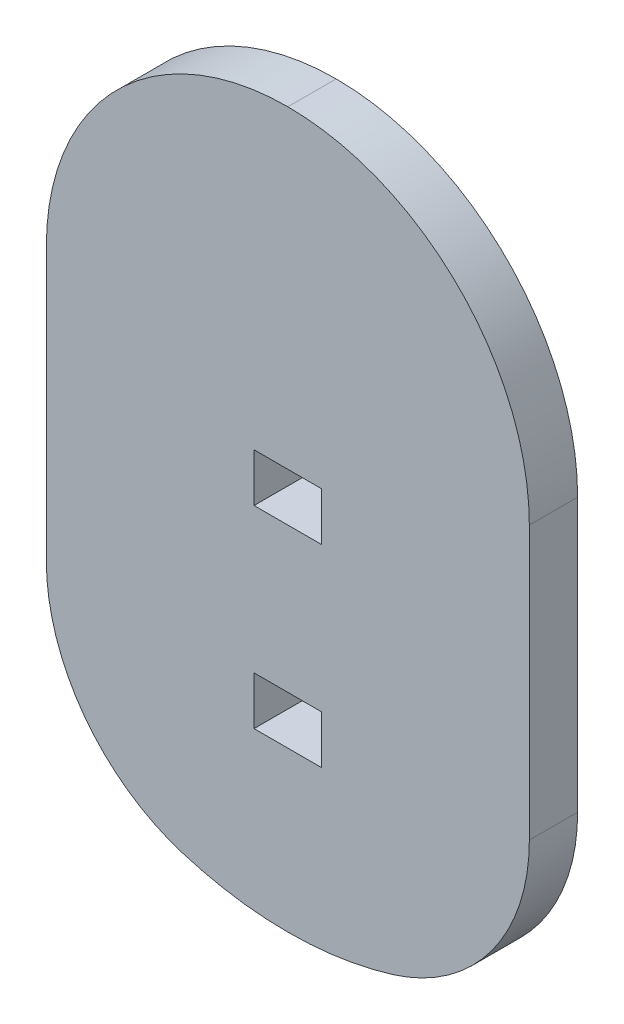
ISO-10303-21;
HEADER;
FILE_DESCRIPTION(('STEP AP214'),'2;1');
FILE_NAME('part.step','',(''),(''),'','','');
FILE_SCHEMA(('AUTOMOTIVE_DESIGN { 1 0 10303 214 1 1 1 1 }'));
ENDSEC;
DATA;
#1=APPLICATION_CONTEXT('core data for automotive mechanical design processes');
#2=APPLICATION_PROTOCOL_DEFINITION('international standard','automotive_design',2000,#1);
#3=PRODUCT_CONTEXT('',#1,'mechanical');
#4=PRODUCT('Part','Part','',(#3));
#5=PRODUCT_RELATED_PRODUCT_CATEGORY('part','',(#4));
#6=PRODUCT_DEFINITION_FORMATION('','',#4);
#7=PRODUCT_DEFINITION_CONTEXT('part definition',#1,'design');
#8=PRODUCT_DEFINITION('design','',#6,#7);
#9=PRODUCT_DEFINITION_SHAPE('','',#8);
#10=(LENGTH_UNIT() NAMED_UNIT(*) SI_UNIT(.MILLI.,.METRE.));
#11=(NAMED_UNIT(*) PLANE_ANGLE_UNIT() SI_UNIT($,.RADIAN.));
#12=(NAMED_UNIT(*) SI_UNIT($,.STERADIAN.) SOLID_ANGLE_UNIT());
#13=UNCERTAINTY_MEASURE_WITH_UNIT(LENGTH_MEASURE(1.E-05),#10,'distance_accuracy_value','');
#14=(GEOMETRIC_REPRESENTATION_CONTEXT(3) GLOBAL_UNCERTAINTY_ASSIGNED_CONTEXT((#13)) GLOBAL_UNIT_ASSIGNED_CONTEXT((#10,
#11,#12)) REPRESENTATION_CONTEXT('',''));
#15=CARTESIAN_POINT('',(0.,0.,0.));
#16=DIRECTION('',(0.,0.,1.));
#17=DIRECTION('',(1.,0.,0.));
#18=AXIS2_PLACEMENT_3D('',#15,#16,#17);
#19=CARTESIAN_POINT('',(0.,0.,5.));
#20=DIRECTION('',(0.,0.,-1.));
#21=DIRECTION('',(-1.,0.,0.));
#22=AXIS2_PLACEMENT_3D('',#19,#20,#21);
#23=CYLINDRICAL_SURFACE('',#22,37.);
#24=CARTESIAN_POINT('',(0.,0.,5.));
#25=DIRECTION('',(0.,0.,1.));
#26=DIRECTION('',(1.,0.,0.));
#27=AXIS2_PLACEMENT_3D('',#24,#25,#26);
#28=CIRCLE('',#27,37.);
#29=CARTESIAN_POINT('',(-10.8823529411765,-35.3634612907683,5.));
#30=VERTEX_POINT('',#29);
#31=CARTESIAN_POINT('',(10.8823529411765,-35.3634612907683,5.));
#32=VERTEX_POINT('',#31);
#33=EDGE_CURVE('E199',#30,#32,#28,.T.);
#34=ORIENTED_EDGE('',*,*,#33,.F.);
#35=DIRECTION('',(0.,0.,-1.));
#36=VECTOR('',#35,1.);
#37=CARTESIAN_POINT('',(-10.8823529411765,-35.3634612907683,5.));
#38=LINE('',#37,#36);
#39=CARTESIAN_POINT('',(-10.8823529411765,-35.3634612907683,0.));
#40=VERTEX_POINT('',#39);
#41=EDGE_CURVE('E235',#30,#40,#38,.T.);
#42=ORIENTED_EDGE('',*,*,#41,.T.);
#43=CARTESIAN_POINT('',(0.,0.,0.));
#44=DIRECTION('',(0.,0.,1.));
#45=DIRECTION('',(1.,0.,0.));
#46=AXIS2_PLACEMENT_3D('',#43,#44,#45);
#47=CIRCLE('',#46,37.);
#48=CARTESIAN_POINT('',(10.8823529411765,-35.3634612907683,0.));
#49=VERTEX_POINT('',#48);
#50=EDGE_CURVE('E195',#40,#49,#47,.T.);
#51=ORIENTED_EDGE('',*,*,#50,.T.);
#52=DIRECTION('',(0.,0.,-1.));
#53=VECTOR('',#52,1.);
#54=CARTESIAN_POINT('',(10.8823529411765,-35.3634612907683,5.));
#55=LINE('',#54,#53);
#56=EDGE_CURVE('E232',#49,#32,#55,.F.);
#57=ORIENTED_EDGE('',*,*,#56,.T.);
#58=EDGE_LOOP('',(#34,#42,#51,#57));
#59=FACE_BOUND('',#58,.T.);
#60=ADVANCED_FACE('F34',(#59),#23,.T.);
#61=CARTESIAN_POINT('',(0.,0.,5.));
#62=DIRECTION('',(0.,0.,1.));
#63=DIRECTION('',(1.,0.,0.));
#64=AXIS2_PLACEMENT_3D('',#61,#62,#63);
#65=PLANE('',#64);
#66=DIRECTION('',(0.,1.,0.));
#67=VECTOR('',#66,1.);
#68=CARTESIAN_POINT('',(3.5,4.5,5.));
#69=LINE('',#68,#67);
#70=CARTESIAN_POINT('',(3.5,-0.500000000000003,5.));
#71=VERTEX_POINT('',#70);
#72=CARTESIAN_POINT('',(3.5,4.5,5.));
#73=VERTEX_POINT('',#72);
#74=EDGE_CURVE('E49',#71,#73,#69,.T.);
#75=ORIENTED_EDGE('',*,*,#74,.F.);
#76=DIRECTION('',(1.,0.,0.));
#77=VECTOR('',#76,1.);
#78=CARTESIAN_POINT('',(-3.5,-0.500000000000003,5.));
#79=LINE('',#78,#77);
#80=CARTESIAN_POINT('',(-3.5,-0.500000000000003,5.));
#81=VERTEX_POINT('',#80);
#82=EDGE_CURVE('E165',#81,#71,#79,.T.);
#83=ORIENTED_EDGE('',*,*,#82,.F.);
#84=DIRECTION('',(0.,-1.,0.));
#85=VECTOR('',#84,1.);
#86=CARTESIAN_POINT('',(-3.5,4.5,5.));
#87=LINE('',#86,#85);
#88=CARTESIAN_POINT('',(-3.5,4.5,5.));
#89=VERTEX_POINT('',#88);
#90=EDGE_CURVE('E148',#89,#81,#87,.T.);
#91=ORIENTED_EDGE('',*,*,#90,.F.);
#92=DIRECTION('',(-1.,0.,0.));
#93=VECTOR('',#92,1.);
#94=CARTESIAN_POINT('',(-3.5,4.5,5.));
#95=LINE('',#94,#93);
#96=EDGE_CURVE('E158',#73,#89,#95,.T.);
#97=ORIENTED_EDGE('',*,*,#96,.F.);
#98=EDGE_LOOP('',(#75,#83,#91,#97));
#99=FACE_BOUND('',#98,.T.);
#100=DIRECTION('',(0.,1.,0.));
#101=VECTOR('',#100,1.);
#102=CARTESIAN_POINT('',(3.5,-15.5,5.));
#103=LINE('',#102,#101);
#104=CARTESIAN_POINT('',(3.5,-20.5,5.));
#105=VERTEX_POINT('',#104);
#106=CARTESIAN_POINT('',(3.5,-15.5,5.));
#107=VERTEX_POINT('',#106);
#108=EDGE_CURVE('E57',#105,#107,#103,.T.);
#109=ORIENTED_EDGE('',*,*,#108,.F.);
#110=DIRECTION('',(1.,0.,0.));
#111=VECTOR('',#110,1.);
#112=CARTESIAN_POINT('',(-3.5,-20.5,5.));
#113=LINE('',#112,#111);
#114=CARTESIAN_POINT('',(-3.5,-20.5,5.));
#115=VERTEX_POINT('',#114);
#116=EDGE_CURVE('E182',#115,#105,#113,.T.);
#117=ORIENTED_EDGE('',*,*,#116,.F.);
#118=DIRECTION('',(0.,-1.,0.));
#119=VECTOR('',#118,1.);
#120=CARTESIAN_POINT('',(-3.5,-15.5,5.));
#121=LINE('',#120,#119);
#122=CARTESIAN_POINT('',(-3.5,-15.5,5.));
#123=VERTEX_POINT('',#122);
#124=EDGE_CURVE('E179',#123,#115,#121,.T.);
#125=ORIENTED_EDGE('',*,*,#124,.F.);
#126=DIRECTION('',(-1.,0.,0.));
#127=VECTOR('',#126,1.);
#128=CARTESIAN_POINT('',(-3.5,-15.5,5.));
#129=LINE('',#128,#127);
#130=EDGE_CURVE('E176',#107,#123,#129,.T.);
#131=ORIENTED_EDGE('',*,*,#130,.F.);
#132=EDGE_LOOP('',(#109,#117,#125,#131));
#133=FACE_BOUND('',#132,.T.);
#134=DIRECTION('',(0.,1.,0.));
#135=VECTOR('',#134,1.);
#136=CARTESIAN_POINT('',(-25.,27.2763633939717,5.));
#137=LINE('',#136,#135);
#138=CARTESIAN_POINT('',(-25.,-16.2480768092719,5.));
#139=VERTEX_POINT('',#138);
#140=CARTESIAN_POINT('',(-25.,12.,5.));
#141=VERTEX_POINT('',#140);
#142=EDGE_CURVE('E193',#139,#141,#137,.T.);
#143=ORIENTED_EDGE('',*,*,#142,.F.);
#144=CARTESIAN_POINT('',(-5.,-16.2480768092719,5.));
#145=DIRECTION('',(0.,0.,1.));
#146=DIRECTION('',(1.,0.,0.));
#147=AXIS2_PLACEMENT_3D('',#144,#145,#146);
#148=CIRCLE('',#147,20.);
#149=EDGE_CURVE('E230',#139,#30,#148,.T.);
#150=ORIENTED_EDGE('',*,*,#149,.T.);
#151=ORIENTED_EDGE('',*,*,#33,.T.);
#152=CARTESIAN_POINT('',(5.,-16.2480768092719,5.));
#153=DIRECTION('',(0.,0.,1.));
#154=DIRECTION('',(1.,0.,0.));
#155=AXIS2_PLACEMENT_3D('',#152,#153,#154);
#156=CIRCLE('',#155,20.);
#157=CARTESIAN_POINT('',(25.,-16.2480768092719,5.));
#158=VERTEX_POINT('',#157);
#159=EDGE_CURVE('E228',#32,#158,#156,.T.);
#160=ORIENTED_EDGE('',*,*,#159,.T.);
#161=DIRECTION('',(0.,-1.,0.));
#162=VECTOR('',#161,1.);
#163=CARTESIAN_POINT('',(25.,-27.2763633939717,5.));
#164=LINE('',#163,#162);
#165=CARTESIAN_POINT('',(25.,12.,5.));
#166=VERTEX_POINT('',#165);
#167=EDGE_CURVE('E196',#166,#158,#164,.T.);
#168=ORIENTED_EDGE('',*,*,#167,.F.);
#169=CARTESIAN_POINT('',(0.,12.,5.));
#170=DIRECTION('',(0.,0.,1.));
#171=DIRECTION('',(1.,0.,0.));
#172=AXIS2_PLACEMENT_3D('',#169,#170,#171);
#173=CIRCLE('',#172,25.);
#174=CARTESIAN_POINT('',(0.,37.,5.));
#175=VERTEX_POINT('',#174);
#176=EDGE_CURVE('E209',#166,#175,#173,.T.);
#177=ORIENTED_EDGE('',*,*,#176,.T.);
#178=CARTESIAN_POINT('',(0.,12.,5.));
#179=DIRECTION('',(0.,0.,1.));
#180=DIRECTION('',(1.,0.,0.));
#181=AXIS2_PLACEMENT_3D('',#178,#179,#180);
#182=CIRCLE('',#181,25.);
#183=EDGE_CURVE('E211',#175,#141,#182,.T.);
#184=ORIENTED_EDGE('',*,*,#183,.T.);
#185=EDGE_LOOP('',(#143,#150,#151,#160,#168,#177,#184));
#186=FACE_BOUND('',#185,.T.);
#187=ADVANCED_FACE('F162',(#99,#133,#186),#65,.T.);
#188=CARTESIAN_POINT('',(0.,0.,0.));
#189=DIRECTION('',(0.,0.,1.));
#190=DIRECTION('',(1.,0.,0.));
#191=AXIS2_PLACEMENT_3D('',#188,#189,#190);
#192=PLANE('',#191);
#193=DIRECTION('',(1.,0.,0.));
#194=VECTOR('',#193,1.);
#195=CARTESIAN_POINT('',(0.,-0.500000000000003,0.));
#196=LINE('',#195,#194);
#197=CARTESIAN_POINT('',(-3.5,-0.500000000000003,0.));
#198=VERTEX_POINT('',#197);
#199=CARTESIAN_POINT('',(3.5,-0.500000000000003,0.));
#200=VERTEX_POINT('',#199);
#201=EDGE_CURVE('E42',#198,#200,#196,.T.);
#202=ORIENTED_EDGE('',*,*,#201,.T.);
#203=DIRECTION('',(0.,1.,0.));
#204=VECTOR('',#203,1.);
#205=CARTESIAN_POINT('',(3.5,0.,0.));
#206=LINE('',#205,#204);
#207=CARTESIAN_POINT('',(3.5,4.5,0.));
#208=VERTEX_POINT('',#207);
#209=EDGE_CURVE('E11',#200,#208,#206,.T.);
#210=ORIENTED_EDGE('',*,*,#209,.T.);
#211=DIRECTION('',(-1.,0.,0.));
#212=VECTOR('',#211,1.);
#213=CARTESIAN_POINT('',(0.,4.5,0.));
#214=LINE('',#213,#212);
#215=CARTESIAN_POINT('',(-3.5,4.5,0.));
#216=VERTEX_POINT('',#215);
#217=EDGE_CURVE('E255',#208,#216,#214,.T.);
#218=ORIENTED_EDGE('',*,*,#217,.T.);
#219=DIRECTION('',(0.,-1.,0.));
#220=VECTOR('',#219,1.);
#221=CARTESIAN_POINT('',(-3.5,0.,0.));
#222=LINE('',#221,#220);
#223=EDGE_CURVE('E151',#216,#198,#222,.T.);
#224=ORIENTED_EDGE('',*,*,#223,.T.);
#225=EDGE_LOOP('',(#202,#210,#218,#224));
#226=FACE_BOUND('',#225,.T.);
#227=DIRECTION('',(1.,0.,0.));
#228=VECTOR('',#227,1.);
#229=CARTESIAN_POINT('',(0.,-20.5,0.));
#230=LINE('',#229,#228);
#231=CARTESIAN_POINT('',(-3.5,-20.5,0.));
#232=VERTEX_POINT('',#231);
#233=CARTESIAN_POINT('',(3.5,-20.5,0.));
#234=VERTEX_POINT('',#233);
#235=EDGE_CURVE('E249',#232,#234,#230,.T.);
#236=ORIENTED_EDGE('',*,*,#235,.T.);
#237=DIRECTION('',(0.,1.,0.));
#238=VECTOR('',#237,1.);
#239=CARTESIAN_POINT('',(3.5,0.,0.));
#240=LINE('',#239,#238);
#241=CARTESIAN_POINT('',(3.5,-15.5,0.));
#242=VERTEX_POINT('',#241);
#243=EDGE_CURVE('E252',#234,#242,#240,.T.);
#244=ORIENTED_EDGE('',*,*,#243,.T.);
#245=DIRECTION('',(-1.,0.,0.));
#246=VECTOR('',#245,1.);
#247=CARTESIAN_POINT('',(0.,-15.5,0.));
#248=LINE('',#247,#246);
#249=CARTESIAN_POINT('',(-3.5,-15.5,0.));
#250=VERTEX_POINT('',#249);
#251=EDGE_CURVE('E243',#242,#250,#248,.T.);
#252=ORIENTED_EDGE('',*,*,#251,.T.);
#253=DIRECTION('',(0.,-1.,0.));
#254=VECTOR('',#253,1.);
#255=CARTESIAN_POINT('',(-3.5,0.,0.));
#256=LINE('',#255,#254);
#257=EDGE_CURVE('E246',#250,#232,#256,.T.);
#258=ORIENTED_EDGE('',*,*,#257,.T.);
#259=EDGE_LOOP('',(#236,#244,#252,#258));
#260=FACE_BOUND('',#259,.T.);
#261=ORIENTED_EDGE('',*,*,#50,.F.);
#262=CARTESIAN_POINT('',(-5.,-16.2480768092719,0.));
#263=DIRECTION('',(0.,0.,1.));
#264=DIRECTION('',(1.,0.,0.));
#265=AXIS2_PLACEMENT_3D('',#262,#263,#264);
#266=CIRCLE('',#265,20.);
#267=CARTESIAN_POINT('',(-25.,-16.2480768092719,0.));
#268=VERTEX_POINT('',#267);
#269=EDGE_CURVE('E239',#40,#268,#266,.F.);
#270=ORIENTED_EDGE('',*,*,#269,.T.);
#271=DIRECTION('',(0.,1.,0.));
#272=VECTOR('',#271,1.);
#273=CARTESIAN_POINT('',(-25.,0.,0.));
#274=LINE('',#273,#272);
#275=CARTESIAN_POINT('',(-25.,12.,0.));
#276=VERTEX_POINT('',#275);
#277=EDGE_CURVE('E207',#268,#276,#274,.T.);
#278=ORIENTED_EDGE('',*,*,#277,.T.);
#279=CARTESIAN_POINT('',(0.,12.,0.));
#280=DIRECTION('',(0.,0.,1.));
#281=DIRECTION('',(1.,0.,0.));
#282=AXIS2_PLACEMENT_3D('',#279,#280,#281);
#283=CIRCLE('',#282,25.);
#284=CARTESIAN_POINT('',(0.,37.,0.));
#285=VERTEX_POINT('',#284);
#286=EDGE_CURVE('E219',#276,#285,#283,.F.);
#287=ORIENTED_EDGE('',*,*,#286,.T.);
#288=CARTESIAN_POINT('',(0.,12.,0.));
#289=DIRECTION('',(0.,0.,1.));
#290=DIRECTION('',(1.,0.,0.));
#291=AXIS2_PLACEMENT_3D('',#288,#289,#290);
#292=CIRCLE('',#291,25.);
#293=CARTESIAN_POINT('',(25.,12.,0.));
#294=VERTEX_POINT('',#293);
#295=EDGE_CURVE('E217',#285,#294,#292,.F.);
#296=ORIENTED_EDGE('',*,*,#295,.T.);
#297=DIRECTION('',(0.,-1.,0.));
#298=VECTOR('',#297,1.);
#299=CARTESIAN_POINT('',(25.,0.,0.));
#300=LINE('',#299,#298);
#301=CARTESIAN_POINT('',(25.,-16.2480768092719,0.));
#302=VERTEX_POINT('',#301);
#303=EDGE_CURVE('E202',#294,#302,#300,.T.);
#304=ORIENTED_EDGE('',*,*,#303,.T.);
#305=CARTESIAN_POINT('',(5.,-16.2480768092719,0.));
#306=DIRECTION('',(0.,0.,1.));
#307=DIRECTION('',(1.,0.,0.));
#308=AXIS2_PLACEMENT_3D('',#305,#306,#307);
#309=CIRCLE('',#308,20.);
#310=EDGE_CURVE('E237',#302,#49,#309,.F.);
#311=ORIENTED_EDGE('',*,*,#310,.T.);
#312=EDGE_LOOP('',(#261,#270,#278,#287,#296,#304,#311));
#313=FACE_BOUND('',#312,.T.);
#314=ADVANCED_FACE('F259',(#226,#260,#313),#192,.F.);
#315=CARTESIAN_POINT('',(25.,-27.2763633939717,-5.));
#316=DIRECTION('',(-1.,0.,0.));
#317=DIRECTION('',(0.,0.,1.));
#318=AXIS2_PLACEMENT_3D('',#315,#316,#317);
#319=PLANE('',#318);
#320=ORIENTED_EDGE('',*,*,#167,.T.);
#321=DIRECTION('',(0.,0.,-1.));
#322=VECTOR('',#321,1.);
#323=CARTESIAN_POINT('',(25.,-16.2480768092719,-5.));
#324=LINE('',#323,#322);
#325=EDGE_CURVE('E241',#158,#302,#324,.T.);
#326=ORIENTED_EDGE('',*,*,#325,.T.);
#327=ORIENTED_EDGE('',*,*,#303,.F.);
#328=DIRECTION('',(0.,0.,-1.));
#329=VECTOR('',#328,1.);
#330=CARTESIAN_POINT('',(25.,12.,-5.));
#331=LINE('',#330,#329);
#332=EDGE_CURVE('E221',#294,#166,#331,.F.);
#333=ORIENTED_EDGE('',*,*,#332,.T.);
#334=EDGE_LOOP('',(#320,#326,#327,#333));
#335=FACE_BOUND('',#334,.T.);
#336=ADVANCED_FACE('F322',(#335),#319,.F.);
#337=CARTESIAN_POINT('',(-25.,27.2763633939717,-5.));
#338=DIRECTION('',(1.,0.,0.));
#339=DIRECTION('',(0.,0.,-1.));
#340=AXIS2_PLACEMENT_3D('',#337,#338,#339);
#341=PLANE('',#340);
#342=ORIENTED_EDGE('',*,*,#277,.F.);
#343=DIRECTION('',(0.,0.,-1.));
#344=VECTOR('',#343,1.);
#345=CARTESIAN_POINT('',(-25.,-16.2480768092719,-5.));
#346=LINE('',#345,#344);
#347=EDGE_CURVE('E223',#268,#139,#346,.F.);
#348=ORIENTED_EDGE('',*,*,#347,.T.);
#349=ORIENTED_EDGE('',*,*,#142,.T.);
#350=DIRECTION('',(0.,0.,-1.));
#351=VECTOR('',#350,1.);
#352=CARTESIAN_POINT('',(-25.,12.,-5.));
#353=LINE('',#352,#351);
#354=EDGE_CURVE('E214',#141,#276,#353,.T.);
#355=ORIENTED_EDGE('',*,*,#354,.T.);
#356=EDGE_LOOP('',(#342,#348,#349,#355));
#357=FACE_BOUND('',#356,.T.);
#358=ADVANCED_FACE('F295',(#357),#341,.F.);
#359=CARTESIAN_POINT('',(0.,12.,5.));
#360=DIRECTION('',(0.,0.,-1.));
#361=DIRECTION('',(-1.,0.,0.));
#362=AXIS2_PLACEMENT_3D('',#359,#360,#361);
#363=CYLINDRICAL_SURFACE('',#362,25.);
#364=ORIENTED_EDGE('',*,*,#332,.F.);
#365=ORIENTED_EDGE('',*,*,#295,.F.);
#366=DIRECTION('',(0.,0.,-1.));
#367=VECTOR('',#366,1.);
#368=CARTESIAN_POINT('',(0.,37.,5.));
#369=LINE('',#368,#367);
#370=EDGE_CURVE('E172',#175,#285,#369,.T.);
#371=ORIENTED_EDGE('',*,*,#370,.F.);
#372=ORIENTED_EDGE('',*,*,#176,.F.);
#373=EDGE_LOOP('',(#364,#365,#371,#372));
#374=FACE_BOUND('',#373,.T.);
#375=ADVANCED_FACE('F292',(#374),#363,.T.);
#376=CARTESIAN_POINT('',(0.,12.,5.));
#377=DIRECTION('',(0.,0.,-1.));
#378=DIRECTION('',(-1.,0.,0.));
#379=AXIS2_PLACEMENT_3D('',#376,#377,#378);
#380=CYLINDRICAL_SURFACE('',#379,25.);
#381=ORIENTED_EDGE('',*,*,#286,.F.);
#382=ORIENTED_EDGE('',*,*,#354,.F.);
#383=ORIENTED_EDGE('',*,*,#183,.F.);
#384=ORIENTED_EDGE('',*,*,#370,.T.);
#385=EDGE_LOOP('',(#381,#382,#383,#384));
#386=FACE_BOUND('',#385,.T.);
#387=ADVANCED_FACE('F288',(#386),#380,.T.);
#388=CARTESIAN_POINT('',(-5.,-16.2480768092719,5.));
#389=DIRECTION('',(0.,0.,-1.));
#390=DIRECTION('',(-1.,0.,0.));
#391=AXIS2_PLACEMENT_3D('',#388,#389,#390);
#392=CYLINDRICAL_SURFACE('',#391,20.);
#393=ORIENTED_EDGE('',*,*,#269,.F.);
#394=ORIENTED_EDGE('',*,*,#41,.F.);
#395=ORIENTED_EDGE('',*,*,#149,.F.);
#396=ORIENTED_EDGE('',*,*,#347,.F.);
#397=EDGE_LOOP('',(#393,#394,#395,#396));
#398=FACE_BOUND('',#397,.T.);
#399=ADVANCED_FACE('F291',(#398),#392,.T.);
#400=CARTESIAN_POINT('',(5.,-16.2480768092719,5.));
#401=DIRECTION('',(0.,0.,-1.));
#402=DIRECTION('',(-1.,0.,0.));
#403=AXIS2_PLACEMENT_3D('',#400,#401,#402);
#404=CYLINDRICAL_SURFACE('',#403,20.);
#405=ORIENTED_EDGE('',*,*,#310,.F.);
#406=ORIENTED_EDGE('',*,*,#325,.F.);
#407=ORIENTED_EDGE('',*,*,#159,.F.);
#408=ORIENTED_EDGE('',*,*,#56,.F.);
#409=EDGE_LOOP('',(#405,#406,#407,#408));
#410=FACE_BOUND('',#409,.T.);
#411=ADVANCED_FACE('F36',(#410),#404,.T.);
#412=CARTESIAN_POINT('',(3.5,-15.5,-5.));
#413=DIRECTION('',(1.,0.,0.));
#414=DIRECTION('',(0.,1.,0.));
#415=AXIS2_PLACEMENT_3D('',#412,#413,#414);
#416=PLANE('',#415);
#417=DIRECTION('',(0.,0.,1.));
#418=VECTOR('',#417,1.);
#419=CARTESIAN_POINT('',(3.5,-20.5,-5.));
#420=LINE('',#419,#418);
#421=EDGE_CURVE('E186',#234,#105,#420,.T.);
#422=ORIENTED_EDGE('',*,*,#421,.T.);
#423=ORIENTED_EDGE('',*,*,#108,.T.);
#424=DIRECTION('',(0.,0.,1.));
#425=VECTOR('',#424,1.);
#426=CARTESIAN_POINT('',(3.5,-15.5,-5.));
#427=LINE('',#426,#425);
#428=EDGE_CURVE('E185',#242,#107,#427,.T.);
#429=ORIENTED_EDGE('',*,*,#428,.F.);
#430=ORIENTED_EDGE('',*,*,#243,.F.);
#431=EDGE_LOOP('',(#422,#423,#429,#430));
#432=FACE_BOUND('',#431,.T.);
#433=ADVANCED_FACE('F302',(#432),#416,.F.);
#434=CARTESIAN_POINT('',(-3.5,-20.5,-5.));
#435=DIRECTION('',(0.,-1.,0.));
#436=DIRECTION('',(0.,0.,-1.));
#437=AXIS2_PLACEMENT_3D('',#434,#435,#436);
#438=PLANE('',#437);
#439=DIRECTION('',(0.,0.,1.));
#440=VECTOR('',#439,1.);
#441=CARTESIAN_POINT('',(-3.5,-20.5,-5.));
#442=LINE('',#441,#440);
#443=EDGE_CURVE('E188',#232,#115,#442,.T.);
#444=ORIENTED_EDGE('',*,*,#443,.T.);
#445=ORIENTED_EDGE('',*,*,#116,.T.);
#446=ORIENTED_EDGE('',*,*,#421,.F.);
#447=ORIENTED_EDGE('',*,*,#235,.F.);
#448=EDGE_LOOP('',(#444,#445,#446,#447));
#449=FACE_BOUND('',#448,.T.);
#450=ADVANCED_FACE('F336',(#449),#438,.F.);
#451=CARTESIAN_POINT('',(-3.5,-15.5,-5.));
#452=DIRECTION('',(-1.,0.,0.));
#453=DIRECTION('',(0.,-1.,0.));
#454=AXIS2_PLACEMENT_3D('',#451,#452,#453);
#455=PLANE('',#454);
#456=DIRECTION('',(0.,0.,1.));
#457=VECTOR('',#456,1.);
#458=CARTESIAN_POINT('',(-3.5,-15.5,-5.));
#459=LINE('',#458,#457);
#460=EDGE_CURVE('E190',#250,#123,#459,.T.);
#461=ORIENTED_EDGE('',*,*,#460,.T.);
#462=ORIENTED_EDGE('',*,*,#124,.T.);
#463=ORIENTED_EDGE('',*,*,#443,.F.);
#464=ORIENTED_EDGE('',*,*,#257,.F.);
#465=EDGE_LOOP('',(#461,#462,#463,#464));
#466=FACE_BOUND('',#465,.T.);
#467=ADVANCED_FACE('F273',(#466),#455,.F.);
#468=CARTESIAN_POINT('',(-3.5,-15.5,-5.));
#469=DIRECTION('',(0.,1.,0.));
#470=DIRECTION('',(0.,0.,1.));
#471=AXIS2_PLACEMENT_3D('',#468,#469,#470);
#472=PLANE('',#471);
#473=ORIENTED_EDGE('',*,*,#428,.T.);
#474=ORIENTED_EDGE('',*,*,#130,.T.);
#475=ORIENTED_EDGE('',*,*,#460,.F.);
#476=ORIENTED_EDGE('',*,*,#251,.F.);
#477=EDGE_LOOP('',(#473,#474,#475,#476));
#478=FACE_BOUND('',#477,.T.);
#479=ADVANCED_FACE('F266',(#478),#472,.F.);
#480=CARTESIAN_POINT('',(3.5,4.5,-5.));
#481=DIRECTION('',(1.,0.,0.));
#482=DIRECTION('',(0.,1.,0.));
#483=AXIS2_PLACEMENT_3D('',#480,#481,#482);
#484=PLANE('',#483);
#485=DIRECTION('',(0.,0.,1.));
#486=VECTOR('',#485,1.);
#487=CARTESIAN_POINT('',(3.5,-0.500000000000003,-5.));
#488=LINE('',#487,#486);
#489=EDGE_CURVE('E170',#200,#71,#488,.T.);
#490=ORIENTED_EDGE('',*,*,#489,.T.);
#491=ORIENTED_EDGE('',*,*,#74,.T.);
#492=DIRECTION('',(0.,0.,1.));
#493=VECTOR('',#492,1.);
#494=CARTESIAN_POINT('',(3.5,4.5,-5.));
#495=LINE('',#494,#493);
#496=EDGE_CURVE('E155',#208,#73,#495,.T.);
#497=ORIENTED_EDGE('',*,*,#496,.F.);
#498=ORIENTED_EDGE('',*,*,#209,.F.);
#499=EDGE_LOOP('',(#490,#491,#497,#498));
#500=FACE_BOUND('',#499,.T.);
#501=ADVANCED_FACE('F264',(#500),#484,.F.);
#502=CARTESIAN_POINT('',(-3.5,-0.500000000000003,-5.));
#503=DIRECTION('',(0.,-1.,0.));
#504=DIRECTION('',(0.,0.,-1.));
#505=AXIS2_PLACEMENT_3D('',#502,#503,#504);
#506=PLANE('',#505);
#507=DIRECTION('',(0.,0.,1.));
#508=VECTOR('',#507,1.);
#509=CARTESIAN_POINT('',(-3.5,-0.500000000000003,-5.));
#510=LINE('',#509,#508);
#511=EDGE_CURVE('E154',#198,#81,#510,.T.);
#512=ORIENTED_EDGE('',*,*,#511,.T.);
#513=ORIENTED_EDGE('',*,*,#82,.T.);
#514=ORIENTED_EDGE('',*,*,#489,.F.);
#515=ORIENTED_EDGE('',*,*,#201,.F.);
#516=EDGE_LOOP('',(#512,#513,#514,#515));
#517=FACE_BOUND('',#516,.T.);
#518=ADVANCED_FACE('F263',(#517),#506,.F.);
#519=CARTESIAN_POINT('',(-3.5,4.5,-5.));
#520=DIRECTION('',(-1.,0.,0.));
#521=DIRECTION('',(0.,-1.,0.));
#522=AXIS2_PLACEMENT_3D('',#519,#520,#521);
#523=PLANE('',#522);
#524=DIRECTION('',(0.,0.,1.));
#525=VECTOR('',#524,1.);
#526=CARTESIAN_POINT('',(-3.5,4.5,-5.));
#527=LINE('',#526,#525);
#528=EDGE_CURVE('E143',#216,#89,#527,.T.);
#529=ORIENTED_EDGE('',*,*,#528,.T.);
#530=ORIENTED_EDGE('',*,*,#90,.T.);
#531=ORIENTED_EDGE('',*,*,#511,.F.);
#532=ORIENTED_EDGE('',*,*,#223,.F.);
#533=EDGE_LOOP('',(#529,#530,#531,#532));
#534=FACE_BOUND('',#533,.T.);
#535=ADVANCED_FACE('F145',(#534),#523,.F.);
#536=CARTESIAN_POINT('',(-3.5,4.5,-5.));
#537=DIRECTION('',(0.,1.,0.));
#538=DIRECTION('',(0.,0.,1.));
#539=AXIS2_PLACEMENT_3D('',#536,#537,#538);
#540=PLANE('',#539);
#541=ORIENTED_EDGE('',*,*,#496,.T.);
#542=ORIENTED_EDGE('',*,*,#96,.T.);
#543=ORIENTED_EDGE('',*,*,#528,.F.);
#544=ORIENTED_EDGE('',*,*,#217,.F.);
#545=EDGE_LOOP('',(#541,#542,#543,#544));
#546=FACE_BOUND('',#545,.T.);
#547=ADVANCED_FACE('F159',(#546),#540,.F.);
#548=CLOSED_SHELL('',(#60,#187,#314,#336,#358,#375,#387,#399,#411,#433,#450,#467,#479,#501,#518,
#535,#547));
#549=MANIFOLD_SOLID_BREP('B2',#548);
#550=ADVANCED_BREP_SHAPE_REPRESENTATION('',(#18,#549),#14);
#551=SHAPE_DEFINITION_REPRESENTATION(#9,#550);
ENDSEC;
END-ISO-10303-21;
